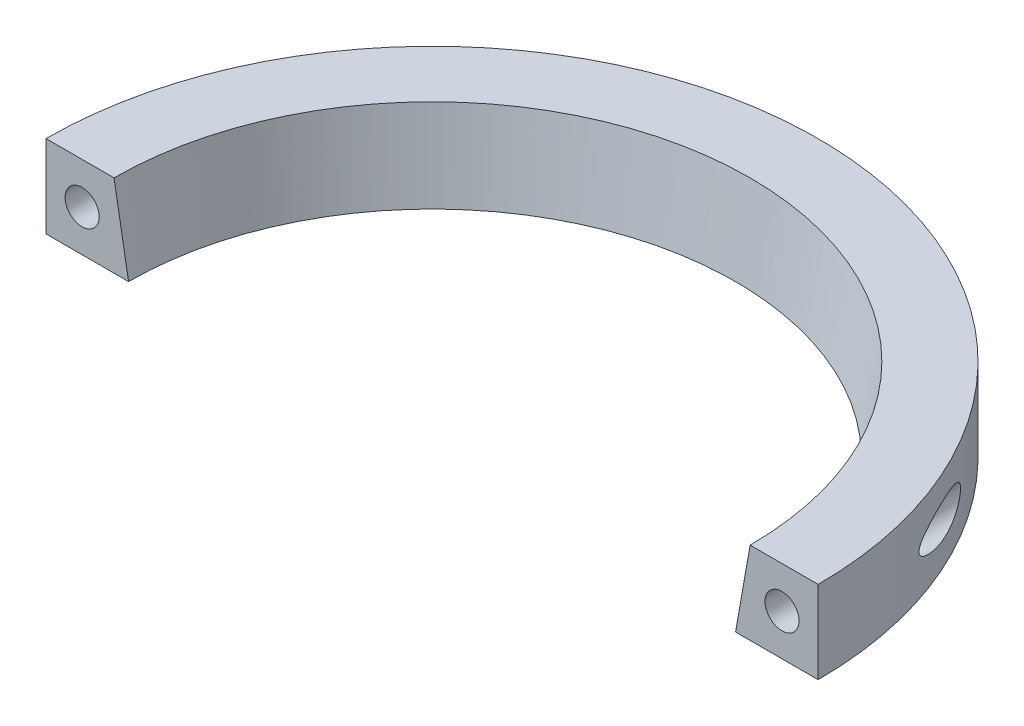
ISO-10303-21;
HEADER;
FILE_DESCRIPTION(('STEP AP214'),'2;1');
FILE_NAME('part.step','',(''),(''),'','','');
FILE_SCHEMA(('AUTOMOTIVE_DESIGN { 1 0 10303 214 1 1 1 1 }'));
ENDSEC;
DATA;
#1=APPLICATION_CONTEXT('core data for automotive mechanical design processes');
#2=APPLICATION_PROTOCOL_DEFINITION('international standard','automotive_design',2000,#1);
#3=PRODUCT_CONTEXT('',#1,'mechanical');
#4=PRODUCT('Part','Part','',(#3));
#5=PRODUCT_RELATED_PRODUCT_CATEGORY('part','',(#4));
#6=PRODUCT_DEFINITION_FORMATION('','',#4);
#7=PRODUCT_DEFINITION_CONTEXT('part definition',#1,'design');
#8=PRODUCT_DEFINITION('design','',#6,#7);
#9=PRODUCT_DEFINITION_SHAPE('','',#8);
#10=(LENGTH_UNIT() NAMED_UNIT(*) SI_UNIT(.MILLI.,.METRE.));
#11=(NAMED_UNIT(*) PLANE_ANGLE_UNIT() SI_UNIT($,.RADIAN.));
#12=(NAMED_UNIT(*) SI_UNIT($,.STERADIAN.) SOLID_ANGLE_UNIT());
#13=UNCERTAINTY_MEASURE_WITH_UNIT(LENGTH_MEASURE(1.E-05),#10,'distance_accuracy_value','');
#14=(GEOMETRIC_REPRESENTATION_CONTEXT(3) GLOBAL_UNCERTAINTY_ASSIGNED_CONTEXT((#13)) GLOBAL_UNIT_ASSIGNED_CONTEXT((#10,
#11,#12)) REPRESENTATION_CONTEXT('',''));
#15=CARTESIAN_POINT('',(0.,0.,0.));
#16=DIRECTION('',(0.,0.,1.));
#17=DIRECTION('',(1.,0.,0.));
#18=AXIS2_PLACEMENT_3D('',#15,#16,#17);
#19=CARTESIAN_POINT('',(0.,0.209999999999997,0.));
#20=DIRECTION('',(0.,1.,0.));
#21=DIRECTION('',(0.,0.,1.));
#22=AXIS2_PLACEMENT_3D('',#19,#20,#21);
#23=CONICAL_SURFACE('',#22,29.4,0.174532925199426);
#24=DIRECTION('',(0.173648177666924,0.984807753012209,0.));
#25=VECTOR('',#24,1.);
#26=CARTESIAN_POINT('',(0.,-166.525685496767,0.));
#27=LINE('',#26,#25);
#28=CARTESIAN_POINT('',(30.8106158456677,8.21,0.));
#29=VERTEX_POINT('',#28);
#30=CARTESIAN_POINT('',(29.4,0.209999999999997,0.));
#31=VERTEX_POINT('',#30);
#32=EDGE_CURVE('E64',#29,#31,#27,.F.);
#33=ORIENTED_EDGE('',*,*,#32,.F.);
#34=CARTESIAN_POINT('',(0.,8.21,0.));
#35=DIRECTION('',(0.,-1.,0.));
#36=DIRECTION('',(0.,0.,-1.));
#37=AXIS2_PLACEMENT_3D('',#34,#35,#36);
#38=CIRCLE('',#37,30.8106158456677);
#39=CARTESIAN_POINT('',(-30.8106158456677,8.21,0.));
#40=VERTEX_POINT('',#39);
#41=EDGE_CURVE('E103',#40,#29,#38,.T.);
#42=ORIENTED_EDGE('',*,*,#41,.F.);
#43=DIRECTION('',(0.173648177666924,-0.984807753012209,0.));
#44=VECTOR('',#43,1.);
#45=CARTESIAN_POINT('',(0.,-166.525685496767,0.));
#46=LINE('',#45,#44);
#47=CARTESIAN_POINT('',(-29.4,0.209999999999997,0.));
#48=VERTEX_POINT('',#47);
#49=EDGE_CURVE('E83',#48,#40,#46,.F.);
#50=ORIENTED_EDGE('',*,*,#49,.F.);
#51=CARTESIAN_POINT('',(0.,0.209999999999997,0.));
#52=DIRECTION('',(0.,-1.,0.));
#53=DIRECTION('',(0.,0.,-1.));
#54=AXIS2_PLACEMENT_3D('',#51,#52,#53);
#55=CIRCLE('',#54,29.4);
#56=EDGE_CURVE('E105',#48,#31,#55,.T.);
#57=ORIENTED_EDGE('',*,*,#56,.T.);
#58=EDGE_LOOP('',(#33,#42,#50,#57));
#59=FACE_BOUND('',#58,.T.);
#60=ADVANCED_FACE('F43',(#59),#23,.F.);
#61=CARTESIAN_POINT('',(-30.8106158456677,8.21,0.));
#62=DIRECTION('',(0.,-1.,0.));
#63=DIRECTION('',(0.,0.,-1.));
#64=AXIS2_PLACEMENT_3D('',#61,#62,#63);
#65=PLANE('',#64);
#66=DIRECTION('',(-1.,0.,0.));
#67=VECTOR('',#66,1.);
#68=CARTESIAN_POINT('',(-37.4,8.21,0.));
#69=LINE('',#68,#67);
#70=CARTESIAN_POINT('',(37.4,8.21,0.));
#71=VERTEX_POINT('',#70);
#72=EDGE_CURVE('E88',#71,#29,#69,.T.);
#73=ORIENTED_EDGE('',*,*,#72,.F.);
#74=CARTESIAN_POINT('',(0.,8.21,0.));
#75=DIRECTION('',(0.,-1.,0.));
#76=DIRECTION('',(0.,0.,-1.));
#77=AXIS2_PLACEMENT_3D('',#74,#75,#76);
#78=CIRCLE('',#77,37.4);
#79=CARTESIAN_POINT('',(-37.4,8.21,0.));
#80=VERTEX_POINT('',#79);
#81=EDGE_CURVE('E96',#80,#71,#78,.T.);
#82=ORIENTED_EDGE('',*,*,#81,.F.);
#83=EDGE_CURVE('E80',#40,#80,#69,.T.);
#84=ORIENTED_EDGE('',*,*,#83,.F.);
#85=ORIENTED_EDGE('',*,*,#41,.T.);
#86=EDGE_LOOP('',(#73,#82,#84,#85));
#87=FACE_BOUND('',#86,.T.);
#88=ADVANCED_FACE('F102',(#87),#65,.F.);
#89=CARTESIAN_POINT('',(0.,0.,0.));
#90=DIRECTION('',(0.,-1.,0.));
#91=DIRECTION('',(0.,0.,-1.));
#92=AXIS2_PLACEMENT_3D('',#89,#90,#91);
#93=CYLINDRICAL_SURFACE('',#92,37.4);
#94=CARTESIAN_POINT('',(-32.25,4.21,-18.9393109695152));
#95=CARTESIAN_POINT('',(-32.250003040921,4.25995243143123,-18.9393059814524));
#96=CARTESIAN_POINT('',(-32.2522936950472,4.30997243086646,-18.9354069065093));
#97=CARTESIAN_POINT('',(-32.2612322917816,4.40850474832843,-18.9201734607114));
#98=CARTESIAN_POINT('',(-32.2678899853057,4.45701343733852,-18.9088224508029));
#99=CARTESIAN_POINT('',(-32.2867974715193,4.56135902840237,-18.8765230999036));
#100=CARTESIAN_POINT('',(-32.2999359944275,4.61655766426438,-18.8540460884688));
#101=CARTESIAN_POINT('',(-32.3304714748397,4.7219646445357,-18.8016364887591));
#102=CARTESIAN_POINT('',(-32.3478746052607,4.77216560546622,-18.7716930919578));
#103=CARTESIAN_POINT('',(-32.3954413226306,4.89176884540605,-18.6895320870268));
#104=CARTESIAN_POINT('',(-32.4275855816299,4.95790263799236,-18.6337439135142));
#105=CARTESIAN_POINT('',(-32.4960900679473,5.07973709609658,-18.5140196841812));
#106=CARTESIAN_POINT('',(-32.5324608267851,5.13541075416725,-18.4500632337818));
#107=CARTESIAN_POINT('',(-32.6040660474101,5.23290913752684,-18.3232003989981));
#108=CARTESIAN_POINT('',(-32.6390745014654,5.27555021750971,-18.2607824375844));
#109=CARTESIAN_POINT('',(-32.7103668894221,5.35459966657334,-18.132767951375));
#110=CARTESIAN_POINT('',(-32.7466518484228,5.39100288195251,-18.0671688551935));
#111=CARTESIAN_POINT('',(-32.8199965397999,5.45842926954832,-17.933589736062));
#112=CARTESIAN_POINT('',(-32.8570571143054,5.48944621347463,-17.8656070646185));
#113=CARTESIAN_POINT('',(-32.9315771445995,5.54673570931878,-17.7278698989735));
#114=CARTESIAN_POINT('',(-32.9690367470112,5.57300644874675,-17.6581147394411));
#115=CARTESIAN_POINT('',(-33.0814648307556,5.64543217067535,-17.4471198318639));
#116=CARTESIAN_POINT('',(-33.1566521583416,5.68534881554764,-17.3038423486837));
#117=CARTESIAN_POINT('',(-33.3063975695427,5.75169675059852,-17.0138356180286));
#118=CARTESIAN_POINT('',(-33.3809549643778,5.7781147883462,-16.8671031257914));
#119=CARTESIAN_POINT('',(-33.5290081470922,5.8195941964132,-16.5708519070616));
#120=CARTESIAN_POINT('',(-33.6024989541988,5.83461295549153,-16.4213248464885));
#121=CARTESIAN_POINT('',(-33.7477375862446,5.85459380297356,-16.120734675822));
#122=CARTESIAN_POINT('',(-33.8194849072594,5.85955301720973,-15.9696711391202));
#123=CARTESIAN_POINT('',(-33.9471134997767,5.86030721858071,-15.696228588496));
#124=CARTESIAN_POINT('',(-34.0033539445983,5.85770452979636,-15.5740165303925));
#125=CARTESIAN_POINT('',(-34.1144234657601,5.84695945873502,-15.3291936697277));
#126=CARTESIAN_POINT('',(-34.1692525199266,5.83881698947968,-15.2065828609358));
#127=CARTESIAN_POINT('',(-34.2774847081481,5.817188412664,-14.9610183506749));
#128=CARTESIAN_POINT('',(-34.3308859374114,5.8036955133198,-14.8380644113834));
#129=CARTESIAN_POINT('',(-34.4361196304185,5.77144318918479,-14.5921742086833));
#130=CARTESIAN_POINT('',(-34.487952081738,5.7526837226964,-14.4692379454224));
#131=CARTESIAN_POINT('',(-34.5897530966618,5.7099252778957,-14.2241523671585));
#132=CARTESIAN_POINT('',(-34.639728848361,5.68594968002339,-14.102001967638));
#133=CARTESIAN_POINT('',(-34.7379733007361,5.63247332751245,-13.8582277258415));
#134=CARTESIAN_POINT('',(-34.7862421162901,5.60297294554034,-13.7366038486154));
#135=CARTESIAN_POINT('',(-34.8808922309029,5.53802123582026,-13.4944518028385));
#136=CARTESIAN_POINT('',(-34.9272765049264,5.50257977936406,-13.373922160716));
#137=CARTESIAN_POINT('',(-35.0180727988963,5.42490428937886,-13.134342791702));
#138=CARTESIAN_POINT('',(-35.0624856962858,5.38267331728822,-13.0152924237379));
#139=CARTESIAN_POINT('',(-35.1270607344015,5.31353422380934,-12.839525795207));
#140=CARTESIAN_POINT('',(-35.1480733422163,5.28975035968668,-12.7818876181996));
#141=CARTESIAN_POINT('',(-35.1895075280365,5.23991391107646,-12.6673700786892));
#142=CARTESIAN_POINT('',(-35.2099290456863,5.21386109599025,-12.610490793993));
#143=CARTESIAN_POINT('',(-35.2500887407307,5.15916357881616,-12.4977925710986));
#144=CARTESIAN_POINT('',(-35.2698273870624,5.1305207062452,-12.441972917622));
#145=CARTESIAN_POINT('',(-35.3085155682301,5.07015625273636,-12.3317531987848));
#146=CARTESIAN_POINT('',(-35.3274653567561,5.03843567266532,-12.2773526791772));
#147=CARTESIAN_POINT('',(-35.3678353940539,4.96500576147638,-12.1606210590382));
#148=CARTESIAN_POINT('',(-35.3890602479179,4.92253565688273,-12.0986950661808));
#149=CARTESIAN_POINT('',(-35.4296208924047,4.83071756009939,-11.9793945929706));
#150=CARTESIAN_POINT('',(-35.4489590054728,4.78137820987131,-11.9220145336844));
#151=CARTESIAN_POINT('',(-35.4773871317516,4.69526834621773,-11.8370662030225));
#152=CARTESIAN_POINT('',(-35.487458278385,4.66148724331749,-11.8068279603268));
#153=CARTESIAN_POINT('',(-35.5060651678312,4.59002222947206,-11.7507531702492));
#154=CARTESIAN_POINT('',(-35.5146031031902,4.55234401512022,-11.7249103401158));
#155=CARTESIAN_POINT('',(-35.5274866839761,4.4832614665296,-11.6858033280927));
#156=CARTESIAN_POINT('',(-35.5323440325032,4.45282691342689,-11.6710195300183));
#157=CARTESIAN_POINT('',(-35.5404738494945,4.38985869254653,-11.6462392778179));
#158=CARTESIAN_POINT('',(-35.5437486031937,4.35732812881383,-11.6362359210648));
#159=CARTESIAN_POINT('',(-35.5483803350279,4.29045926858498,-11.6220787882901));
#160=CARTESIAN_POINT('',(-35.5497157190987,4.25610496717942,-11.6179908800763));
#161=CARTESIAN_POINT('',(-35.5502017271167,4.18723703936333,-11.6165037161228));
#162=CARTESIAN_POINT('',(-35.5493530756292,4.152723469583,-11.6191022421235));
#163=CARTESIAN_POINT('',(-35.5458857126761,4.09000480298218,-11.6297046916516));
#164=CARTESIAN_POINT('',(-35.5435509069154,4.06162859981835,-11.6368414708256));
#165=CARTESIAN_POINT('',(-35.5376129255177,4.00628631733695,-11.6549628437515));
#166=CARTESIAN_POINT('',(-35.5340090522698,3.97932102298394,-11.6659495538077));
#167=CARTESIAN_POINT('',(-35.5230780480731,3.90993811826344,-11.6992048761214));
#168=CARTESIAN_POINT('',(-35.51485772545,3.86895586888882,-11.7241514615594));
#169=CARTESIAN_POINT('',(-35.4965153825347,3.79138445503394,-11.779569293759));
#170=CARTESIAN_POINT('',(-35.4863870514696,3.75481054907108,-11.8100588619942));
#171=CARTESIAN_POINT('',(-35.4650022902094,3.68603386392152,-11.874120471547));
#172=CARTESIAN_POINT('',(-35.4537663761862,3.65377078837285,-11.9076357407975));
#173=CARTESIAN_POINT('',(-35.4303669130415,3.59229485827762,-11.9770800383619));
#174=CARTESIAN_POINT('',(-35.4182024190267,3.56308518433614,-12.0130115207892));
#175=CARTESIAN_POINT('',(-35.3931412278254,3.50717060230387,-12.0866484547947));
#176=CARTESIAN_POINT('',(-35.380242945814,3.48047147372592,-12.1243577134025));
#177=CARTESIAN_POINT('',(-35.3538834140515,3.42926281778478,-12.2010069931674));
#178=CARTESIAN_POINT('',(-35.3404224062066,3.40475236347412,-12.239946483746));
#179=CARTESIAN_POINT('',(-35.3051206909485,3.3439798661863,-12.3415061654108));
#180=CARTESIAN_POINT('',(-35.2829259982093,3.30909633784956,-12.4048273974074));
#181=CARTESIAN_POINT('',(-35.237579020906,3.24305665459419,-12.5330628876053));
#182=CARTESIAN_POINT('',(-35.2144262676214,3.21190235387965,-12.5979779190862));
#183=CARTESIAN_POINT('',(-35.1436735094947,3.12300827349466,-12.7945922542695));
#184=CARTESIAN_POINT('',(-35.0948459049371,3.06994658622343,-12.927967860478));
#185=CARTESIAN_POINT('',(-34.9942917406438,2.97311238688459,-13.1977433298338));
#186=CARTESIAN_POINT('',(-34.9425516142321,2.92938884281856,-13.3341551835886));
#187=CARTESIAN_POINT('',(-34.8367180777574,2.8500635827698,-13.608256016594));
#188=CARTESIAN_POINT('',(-34.7826268366438,2.81445456269351,-13.7459437302823));
#189=CARTESIAN_POINT('',(-34.678220390221,2.75394309485988,-14.0070914313479));
#190=CARTESIAN_POINT('',(-34.628133088895,2.72829787295041,-14.1304726043962));
#191=CARTESIAN_POINT('',(-34.5262714995888,2.68245168688733,-14.3775670688666));
#192=CARTESIAN_POINT('',(-34.4744970043915,2.66225139431276,-14.5012803993582));
#193=CARTESIAN_POINT('',(-34.3692833195303,2.62716996310273,-14.7489146553145));
#194=CARTESIAN_POINT('',(-34.3158423684699,2.61229467535692,-14.8728356597344));
#195=CARTESIAN_POINT('',(-34.2074139141674,2.58793819800907,-15.1205527521184));
#196=CARTESIAN_POINT('',(-34.1524262042419,2.57845773291054,-15.2443488210767));
#197=CARTESIAN_POINT('',(-34.0411763750572,2.56509952471183,-15.49117732477));
#198=CARTESIAN_POINT('',(-33.9849191022733,2.56120325352032,-15.6142109299043));
#199=CARTESIAN_POINT('',(-33.8710614292756,2.55927160184776,-15.8596815224611));
#200=CARTESIAN_POINT('',(-33.8134612656704,2.56123519652515,-15.9821186104581));
#201=CARTESIAN_POINT('',(-33.6971085775815,2.57148170213351,-16.2260008545448));
#202=CARTESIAN_POINT('',(-33.6383575680828,2.5797567863431,-16.3474470510371));
#203=CARTESIAN_POINT('',(-33.5198254235491,2.60325836242518,-16.5891353045464));
#204=CARTESIAN_POINT('',(-33.4600445645043,2.61848301892694,-16.70937767093));
#205=CARTESIAN_POINT('',(-33.3441736631368,2.65533823346184,-16.9393448325563));
#206=CARTESIAN_POINT('',(-33.2881398702023,2.67640802248214,-17.0491866387508));
#207=CARTESIAN_POINT('',(-33.1756798838446,2.72620530137288,-17.2669999748657));
#208=CARTESIAN_POINT('',(-33.1192535468462,2.75493575398866,-17.3749707639316));
#209=CARTESIAN_POINT('',(-33.0065958163215,2.82126051749046,-17.5880389192485));
#210=CARTESIAN_POINT('',(-32.950364255503,2.85883818935977,-17.6931412710869));
#211=CARTESIAN_POINT('',(-32.8388141729378,2.94456161253383,-17.899329867107));
#212=CARTESIAN_POINT('',(-32.7834946663703,2.99269503577367,-18.0004206351069));
#213=CARTESIAN_POINT('',(-32.6746380463612,3.10229787563907,-18.1972707455172));
#214=CARTESIAN_POINT('',(-32.6211112809239,3.16383306069725,-18.2930007594948));
#215=CARTESIAN_POINT('',(-32.5444002604095,3.26835682203029,-18.4289104742725));
#216=CARTESIAN_POINT('',(-32.5194670846295,3.30515966035961,-18.4728623821739));
#217=CARTESIAN_POINT('',(-32.4712719294046,3.38335175816054,-18.5574473983211));
#218=CARTESIAN_POINT('',(-32.4480082866089,3.42473634528271,-18.5980838154666));
#219=CARTESIAN_POINT('',(-32.4045098211826,3.51123100888868,-18.673767451087));
#220=CARTESIAN_POINT('',(-32.3842033975921,3.55618557101272,-18.7089490067652));
#221=CARTESIAN_POINT('',(-32.3466568456291,3.65122168525294,-18.7737901169529));
#222=CARTESIAN_POINT('',(-32.329418790126,3.70130666756293,-18.8034459391212));
#223=CARTESIAN_POINT('',(-32.298973708579,3.80715268918387,-18.8556948276426));
#224=CARTESIAN_POINT('',(-32.2858234164153,3.86298043011605,-18.8781885876971));
#225=CARTESIAN_POINT('',(-32.2652674728955,3.9785821229174,-18.9133007301564));
#226=CARTESIAN_POINT('',(-32.2578382040157,4.03833873358731,-18.9259597144188));
#227=CARTESIAN_POINT('',(-32.2525018205757,4.11728607153887,-18.9350502744358));
#228=CARTESIAN_POINT('',(-32.2515659124604,4.13577562825845,-18.9366443047199));
#229=CARTESIAN_POINT('',(-32.250314381556,4.17284032941674,-18.9387756737397));
#230=CARTESIAN_POINT('',(-32.249998868643,4.1914154884324,-18.939312825295));
#231=CARTESIAN_POINT('',(-32.25,4.21,-18.9393109695152));
#232=B_SPLINE_CURVE_WITH_KNOTS('',3,(#94,#95,#96,#97,#98,#99,#100,#101,#102,#103,#104,#105,#106,
#107,#108,#109,#110,#111,#112,#113,#114,#115,#116,#117,#118,#119,#120,#121,#122,#123,#124,#125,
#126,#127,#128,#129,#130,#131,#132,#133,#134,#135,#136,#137,#138,#139,#140,#141,#142,#143,#144,
#145,#146,#147,#148,#149,#150,#151,#152,#153,#154,#155,#156,#157,#158,#159,#160,#161,#162,#163,
#164,#165,#166,#167,#168,#169,#170,#171,#172,#173,#174,#175,#176,#177,#178,#179,#180,#181,#182,
#183,#184,#185,#186,#187,#188,#189,#190,#191,#192,#193,#194,#195,#196,#197,#198,#199,#200,#201,
#202,#203,#204,#205,#206,#207,#208,#209,#210,#211,#212,#213,#214,#215,#216,#217,#218,#219,#220,
#221,#222,#223,#224,#225,#226,#227,#228,#229,#230,#231),.UNSPECIFIED.,.T.,.F.,(4,2,2,2,2,2,2,2,
2,2,2,2,2,2,2,2,2,2,2,2,2,2,2,2,2,2,2,2,2,2,2,2,2,2,2,2,2,2,2,2,2,2,2,2,2,2,2,2,2,2,2,2,2,2,2,2,
2,2,2,2,2,2,2,2,2,2,2,2,4),(0.,0.149779530737637,0.299894639403961,0.481966078215499,
0.66430263413866,0.939652984735575,1.21570478686932,1.4652603692312,1.71502114968492,
1.96506883950253,2.21521181710692,2.71435875621433,3.21399480218453,3.71548944471933,
4.21712735185833,4.62067698984021,5.02423296397418,5.42830285647754,5.83237594825931,
6.23467385454052,6.63694463415133,7.03855353484757,7.4399818526693,7.6373395446979,
7.83471731809659,8.03195674456314,8.22913224262428,8.46295280840299,8.69648182690896,
8.83554333471149,8.97440436793215,9.07660542918438,9.17865846990673,9.28183933972092,
9.38498598315383,9.47269619248133,9.56045469187576,9.70564127483096,9.85131677556365,
9.99467414220873,10.1381793808029,10.2820072838474,10.4257739810808,10.6524848467624,
10.8793079708982,11.3336461895165,11.7903113796582,12.2465638754836,12.6532655454996,
13.0600173552778,13.4672147247866,13.8744667664073,14.2803644117224,14.6861910730922,
15.0915152954917,15.4967325343009,15.8718064713704,16.2470256784191,16.6215447674577,
16.9956287631123,17.3715916711888,17.5589166902695,17.746052409737,17.9273793805291,
18.1088283876214,18.2926935741934,18.4757955980454,18.5315103346963,18.5872349379204),.UNSPECIFIED.);
#233=CARTESIAN_POINT('',(-32.25,4.21,-18.9393109695152));
#234=VERTEX_POINT('',#233);
#235=EDGE_CURVE('E133',#234,#234,#232,.T.);
#236=ORIENTED_EDGE('',*,*,#235,.T.);
#237=EDGE_LOOP('',(#236));
#238=FACE_BOUND('',#237,.T.);
#239=CARTESIAN_POINT('',(35.55,4.21,-11.6171209858554));
#240=CARTESIAN_POINT('',(35.5499994682783,4.24368247687896,-11.6171226552124));
#241=CARTESIAN_POINT('',(35.5489551704888,4.27736982730972,-11.620319745938));
#242=CARTESIAN_POINT('',(35.5449241501142,4.34352577418337,-11.6326440062445));
#243=CARTESIAN_POINT('',(35.5419343202271,4.37599233294645,-11.6417806621654));
#244=CARTESIAN_POINT('',(35.5333842765634,4.44694025073435,-11.6678545533662));
#245=CARTESIAN_POINT('',(35.5273627679664,4.4848416139824,-11.6861876082126));
#246=CARTESIAN_POINT('',(35.5134959802766,4.55711867465923,-11.7282606736269));
#247=CARTESIAN_POINT('',(35.5056465758033,4.59148613966079,-11.7520129122643));
#248=CARTESIAN_POINT('',(35.481959655402,4.6828555704277,-11.8234019176079));
#249=CARTESIAN_POINT('',(35.4647116663888,4.73628057733664,-11.8750796040871));
#250=CARTESIAN_POINT('',(35.4278413812113,4.83529035027536,-11.9846337780311));
#251=CARTESIAN_POINT('',(35.4082119392264,4.88085047388509,-12.04252885869));
#252=CARTESIAN_POINT('',(35.3724970858217,4.95531378773588,-12.1469621787855));
#253=CARTESIAN_POINT('',(35.3567599519192,4.985526396826,-12.1927002970275));
#254=CARTESIAN_POINT('',(35.3245681074942,5.04318383720766,-12.2856547082094));
#255=CARTESIAN_POINT('',(35.308113136666,5.07062765231231,-12.3328715355853));
#256=CARTESIAN_POINT('',(35.2578054802596,5.14956393280626,-12.4762735695969));
#257=CARTESIAN_POINT('',(35.2230592200084,5.19756353536464,-12.5740662265082));
#258=CARTESIAN_POINT('',(35.1515484328459,5.28675120124603,-12.7726218882067));
#259=CARTESIAN_POINT('',(35.1147738844519,5.32790047426099,-12.8733982393422));
#260=CARTESIAN_POINT('',(35.0396698931256,5.40436994784153,-13.0764383356441));
#261=CARTESIAN_POINT('',(35.0013418818957,5.43969537015134,-13.1787006579432));
#262=CARTESIAN_POINT('',(34.9193706883913,5.50866452199856,-13.3944827032715));
#263=CARTESIAN_POINT('',(34.8755781765204,5.5417909175442,-13.5081098279629));
#264=CARTESIAN_POINT('',(34.7863862301174,5.60274363927432,-13.736168745922));
#265=CARTESIAN_POINT('',(34.7409864803064,5.63056891867338,-13.8506006934979));
#266=CARTESIAN_POINT('',(34.6486228879719,5.681340841206,-14.0800654591813));
#267=CARTESIAN_POINT('',(34.6016573741979,5.70428206499812,-14.1950988011368));
#268=CARTESIAN_POINT('',(34.506275906189,5.74545563547477,-14.4254105883917));
#269=CARTESIAN_POINT('',(34.4578597991538,5.76368748413095,-14.5406890583153));
#270=CARTESIAN_POINT('',(34.3109564926872,5.81131486650414,-14.8855793098651));
#271=CARTESIAN_POINT('',(34.2103922335396,5.83387126034672,-15.1152954088129));
#272=CARTESIAN_POINT('',(34.0043358747897,5.85996450519346,-15.5733159821687));
#273=CARTESIAN_POINT('',(33.8988488221135,5.8635204216976,-15.8016216419203));
#274=CARTESIAN_POINT('',(33.6933362793738,5.84994397272499,-16.2348740180461));
#275=CARTESIAN_POINT('',(33.5936930159261,5.83467306946266,-16.4400482477438));
#276=CARTESIAN_POINT('',(33.4421181700837,5.79605058888099,-16.7450800886247));
#277=CARTESIAN_POINT('',(33.3911702180065,5.78052493733502,-16.8464396129842));
#278=CARTESIAN_POINT('',(33.2887949892258,5.74358879475525,-17.0478407299593));
#279=CARTESIAN_POINT('',(33.2373677737507,5.72217904575139,-17.1478824870896));
#280=CARTESIAN_POINT('',(33.1336519248446,5.67238240767356,-17.347446850233));
#281=CARTESIAN_POINT('',(33.0813605473666,5.64391182979678,-17.4469474197191));
#282=CARTESIAN_POINT('',(32.9769257026534,5.57902113781097,-17.6435472719169));
#283=CARTESIAN_POINT('',(32.9247823724159,5.5425951949566,-17.7406447355382));
#284=CARTESIAN_POINT('',(32.8214827295274,5.46045977199558,-17.9310334598993));
#285=CARTESIAN_POINT('',(32.7703240303134,5.41477700590877,-18.0243347659563));
#286=CARTESIAN_POINT('',(32.6699941093832,5.31214768312252,-18.2055529228832));
#287=CARTESIAN_POINT('',(32.6208192124039,5.25522322749259,-18.2934799024126));
#288=CARTESIAN_POINT('',(32.5299738353796,5.13244999476658,-18.454502648338));
#289=CARTESIAN_POINT('',(32.4880172302091,5.06764758476045,-18.528220543892));
#290=CARTESIAN_POINT('',(32.4102115125455,4.92388805248498,-18.6639816910188));
#291=CARTESIAN_POINT('',(32.3743243048473,4.8450261300483,-18.7260980391384));
#292=CARTESIAN_POINT('',(32.3284624721856,4.71487164549116,-18.8050919851654));
#293=CARTESIAN_POINT('',(32.3144715494209,4.66934521545711,-18.8291136780862));
#294=CARTESIAN_POINT('',(32.2900409496405,4.57458417111339,-18.8709786926619));
#295=CARTESIAN_POINT('',(32.2796000810526,4.52535080782274,-18.8888240874212));
#296=CARTESIAN_POINT('',(32.2630584613481,4.42354117696999,-18.9170647191701));
#297=CARTESIAN_POINT('',(32.2569978903625,4.37093866305809,-18.927390990097));
#298=CARTESIAN_POINT('',(32.2500370282672,4.2644237947419,-18.9392492919137));
#299=CARTESIAN_POINT('',(32.2491322097116,4.21051263130709,-18.9407890385585));
#300=CARTESIAN_POINT('',(32.2524037255057,4.10868326759371,-18.93521739458));
#301=CARTESIAN_POINT('',(32.2560866327741,4.06069944283642,-18.928946117369));
#302=CARTESIAN_POINT('',(32.2673651902734,3.96657667256433,-18.9097135424219));
#303=CARTESIAN_POINT('',(32.2749632688803,3.92043889121575,-18.8967480926306));
#304=CARTESIAN_POINT('',(32.2963525300489,3.81706720264777,-18.8601745119834));
#305=CARTESIAN_POINT('',(32.311331975004,3.76081063511761,-18.834515631902));
#306=CARTESIAN_POINT('',(32.3455479292245,3.65380579375016,-18.7756941663957));
#307=CARTESIAN_POINT('',(32.3647929647975,3.6030688600336,-18.7425165490631));
#308=CARTESIAN_POINT('',(32.4177551639686,3.48058294973156,-18.650824448263));
#309=CARTESIAN_POINT('',(32.4535980299447,3.41268924772449,-18.5884314889572));
#310=CARTESIAN_POINT('',(32.5294486630221,3.28836510713235,-18.4553755878205));
#311=CARTESIAN_POINT('',(32.5694670516865,3.23196503630817,-18.3846914956764));
#312=CARTESIAN_POINT('',(32.6486322714173,3.13284212845018,-18.243706802609));
#313=CARTESIAN_POINT('',(32.6876030666132,3.08939511069503,-18.1738074121775));
#314=CARTESIAN_POINT('',(32.7667324269242,3.00942888753027,-18.0307498302588));
#315=CARTESIAN_POINT('',(32.8068919767444,2.97291562248739,-17.9575889101739));
#316=CARTESIAN_POINT('',(32.887859076824,2.90583923527479,-17.8088714125537));
#317=CARTESIAN_POINT('',(32.9286671490074,2.87528119854696,-17.7333128510245));
#318=CARTESIAN_POINT('',(33.0105501481321,2.81937703755867,-17.5804185045217));
#319=CARTESIAN_POINT('',(33.0516251685769,2.79403285371705,-17.5030820697455));
#320=CARTESIAN_POINT('',(33.174707167338,2.72496660690864,-17.2693287251131));
#321=CARTESIAN_POINT('',(33.2567270147007,2.68808851640717,-17.1108818312346));
#322=CARTESIAN_POINT('',(33.4195741968804,2.62912225407114,-16.7906057014211));
#323=CARTESIAN_POINT('',(33.5004002608002,2.60704886919682,-16.6287732498079));
#324=CARTESIAN_POINT('',(33.6605893485136,2.57541103324399,-16.302085768243));
#325=CARTESIAN_POINT('',(33.7399417940737,2.56591651753997,-16.137218964115));
#326=CARTESIAN_POINT('',(33.8962663272875,2.55815080359369,-15.8062209095848));
#327=CARTESIAN_POINT('',(33.9732395482316,2.55987417653198,-15.6400903096634));
#328=CARTESIAN_POINT('',(34.1028085771889,2.57161872933783,-15.3549807306801));
#329=CARTESIAN_POINT('',(34.1560490872771,2.57911114795368,-15.2361810091979));
#330=CARTESIAN_POINT('',(34.2611334494357,2.59911684950966,-14.998387513245));
#331=CARTESIAN_POINT('',(34.3129773334853,2.61163001738262,-14.879393743284));
#332=CARTESIAN_POINT('',(34.4152806225252,2.64161499069909,-14.6412186889607));
#333=CARTESIAN_POINT('',(34.4657377897006,2.65909434782855,-14.5220373960482));
#334=CARTESIAN_POINT('',(34.5651158571545,2.69904358795664,-14.2838863833964));
#335=CARTESIAN_POINT('',(34.6140369498947,2.72151284287792,-14.1649166389276));
#336=CARTESIAN_POINT('',(34.7098291411224,2.77140116986386,-13.9285272872565));
#337=CARTESIAN_POINT('',(34.7567151130799,2.79877207799532,-13.8111035767322));
#338=CARTESIAN_POINT('',(34.8488208760305,2.85897525526437,-13.5770208510534));
#339=CARTESIAN_POINT('',(34.8940409801031,2.89180649173831,-13.4603616956332));
#340=CARTESIAN_POINT('',(34.9826035630863,2.96352053725615,-13.2284851780051));
#341=CARTESIAN_POINT('',(35.0259497150387,3.00239075160211,-13.1132653424461));
#342=CARTESIAN_POINT('',(35.1106434039406,3.08730184848147,-12.8847789244606));
#343=CARTESIAN_POINT('',(35.1519922204684,3.13333805814819,-12.7715111222215));
#344=CARTESIAN_POINT('',(35.205365898881,3.20056116612134,-12.623143150926));
#345=CARTESIAN_POINT('',(35.2184536874431,3.21769948313764,-12.5865804725061));
#346=CARTESIAN_POINT('',(35.2443481589263,3.25307340575066,-12.5138887653537));
#347=CARTESIAN_POINT('',(35.2571548292742,3.27130906029043,-12.4777597560499));
#348=CARTESIAN_POINT('',(35.2952688091127,3.32805857895559,-12.3697146386808));
#349=CARTESIAN_POINT('',(35.3201135577482,3.36842135988593,-12.2985758747193));
#350=CARTESIAN_POINT('',(35.3598231935909,3.44028464866252,-12.1838093379247));
#351=CARTESIAN_POINT('',(35.3751540286171,3.46998574891118,-12.1392176497215));
#352=CARTESIAN_POINT('',(35.4049700277388,3.53267144832758,-12.0519798931625));
#353=CARTESIAN_POINT('',(35.4194541099465,3.56566010852727,-12.0093363284715));
#354=CARTESIAN_POINT('',(35.4471387893264,3.63532059080594,-11.9273721129302));
#355=CARTESIAN_POINT('',(35.4603496137679,3.67195722128132,-11.8880253871016));
#356=CARTESIAN_POINT('',(35.4851148916363,3.75001820235458,-11.8138957627847));
#357=CARTESIAN_POINT('',(35.496674612097,3.79142653109101,-11.7790983833587));
#358=CARTESIAN_POINT('',(35.5137027843172,3.86454941926169,-11.727633115703));
#359=CARTESIAN_POINT('',(35.5198894798409,3.89460718834264,-11.7088752179267));
#360=CARTESIAN_POINT('',(35.5308372581938,3.95725929487748,-11.6756117349185));
#361=CARTESIAN_POINT('',(35.5355999160583,3.98985077928605,-11.6611014520514));
#362=CARTESIAN_POINT('',(35.5428241693593,4.0533851019897,-11.6390622998712));
#363=CARTESIAN_POINT('',(35.5454869816598,4.08408853843955,-11.6309237334195));
#364=CARTESIAN_POINT('',(35.5490742393972,4.14652728312988,-11.6199550629722));
#365=CARTESIAN_POINT('',(35.5500005010338,4.17826147794513,-11.6171194128438));
#366=CARTESIAN_POINT('',(35.55,4.21,-11.6171209858554));
#367=B_SPLINE_CURVE_WITH_KNOTS('',3,(#239,#240,#241,#242,#243,#244,#245,#246,#247,#248,#249,
#250,#251,#252,#253,#254,#255,#256,#257,#258,#259,#260,#261,#262,#263,#264,#265,#266,#267,#268,
#269,#270,#271,#272,#273,#274,#275,#276,#277,#278,#279,#280,#281,#282,#283,#284,#285,#286,#287,
#288,#289,#290,#291,#292,#293,#294,#295,#296,#297,#298,#299,#300,#301,#302,#303,#304,#305,#306,
#307,#308,#309,#310,#311,#312,#313,#314,#315,#316,#317,#318,#319,#320,#321,#322,#323,#324,#325,
#326,#327,#328,#329,#330,#331,#332,#333,#334,#335,#336,#337,#338,#339,#340,#341,#342,#343,#344,
#345,#346,#347,#348,#349,#350,#351,#352,#353,#354,#355,#356,#357,#358,#359,#360,#361,#362,#363,
#364,#365,#366),.UNSPECIFIED.,.T.,.F.,(4,2,2,2,2,2,2,2,2,2,2,2,2,2,2,2,2,2,2,2,2,2,2,2,2,2,2,2,
2,2,2,2,2,2,2,2,2,2,2,2,2,2,2,2,2,2,2,2,2,2,2,2,2,2,2,2,2,2,2,2,2,2,2,4),(0.,0.100902604953385,
0.201966763133163,0.328827490689112,0.45597735377775,0.683613659892378,0.91195074217552,
1.08293345509778,1.25397869456084,1.59660952637787,1.94111898495218,2.28531785163567,
2.66377537163381,3.04230754649939,3.4212575759141,3.80024766386216,4.55477442480359,
5.30854393450025,5.99340915982462,6.33678515228684,6.68011786224974,7.02773262923323,
7.37560294655692,7.722483297053,8.06868835352823,8.38781282574322,8.7048532805253,
8.86439640079557,9.02388591759191,9.18482046725025,9.34561367286395,9.49051258849399,
9.63550148571905,9.82529828712275,10.0154779425752,10.3106051134677,10.6065022202593,
10.8792893254192,11.1523090918913,11.4255609905395,11.6989144010145,12.2445831737976,
12.7907961528831,13.3400333707889,13.8890048089183,14.2801059305536,14.6711980893177,
15.0628881630449,15.4545289627425,15.8425138415779,16.2304254275251,16.6175385967906,
17.0044003832125,17.1317294559585,17.2590642120059,17.5152364315135,17.6823222354683,
17.8496170563216,18.0154308527756,18.1807032869581,18.2883271445261,18.3958315222381,
18.4910102210403,18.5860893200096),.UNSPECIFIED.);
#368=CARTESIAN_POINT('',(35.55,4.21,-11.6171209858554));
#369=VERTEX_POINT('',#368);
#370=EDGE_CURVE('E89',#369,#369,#367,.T.);
#371=ORIENTED_EDGE('',*,*,#370,.T.);
#372=EDGE_LOOP('',(#371));
#373=FACE_BOUND('',#372,.T.);
#374=DIRECTION('',(0.,-1.,0.));
#375=VECTOR('',#374,1.);
#376=CARTESIAN_POINT('',(-37.4,0.209999999999997,0.));
#377=LINE('',#376,#375);
#378=CARTESIAN_POINT('',(-37.4,0.209999999999997,0.));
#379=VERTEX_POINT('',#378);
#380=EDGE_CURVE('E56',#80,#379,#377,.T.);
#381=ORIENTED_EDGE('',*,*,#380,.F.);
#382=ORIENTED_EDGE('',*,*,#81,.T.);
#383=DIRECTION('',(0.,-1.,0.));
#384=VECTOR('',#383,1.);
#385=CARTESIAN_POINT('',(37.4,0.,0.));
#386=LINE('',#385,#384);
#387=CARTESIAN_POINT('',(37.4,0.209999999999997,0.));
#388=VERTEX_POINT('',#387);
#389=EDGE_CURVE('E99',#388,#71,#386,.F.);
#390=ORIENTED_EDGE('',*,*,#389,.F.);
#391=CARTESIAN_POINT('',(0.,0.209999999999997,0.));
#392=DIRECTION('',(0.,-1.,0.));
#393=DIRECTION('',(0.,0.,-1.));
#394=AXIS2_PLACEMENT_3D('',#391,#392,#393);
#395=CIRCLE('',#394,37.4);
#396=EDGE_CURVE('E98',#379,#388,#395,.T.);
#397=ORIENTED_EDGE('',*,*,#396,.F.);
#398=EDGE_LOOP('',(#381,#382,#390,#397));
#399=FACE_BOUND('',#398,.T.);
#400=ADVANCED_FACE('F94',(#238,#373,#399),#93,.T.);
#401=CARTESIAN_POINT('',(-37.4,0.209999999999997,0.));
#402=DIRECTION('',(0.,1.,0.));
#403=DIRECTION('',(0.,0.,1.));
#404=AXIS2_PLACEMENT_3D('',#401,#402,#403);
#405=PLANE('',#404);
#406=DIRECTION('',(1.,0.,0.));
#407=VECTOR('',#406,1.);
#408=CARTESIAN_POINT('',(-37.4,0.209999999999997,0.));
#409=LINE('',#408,#407);
#410=EDGE_CURVE('E11',#379,#48,#409,.T.);
#411=ORIENTED_EDGE('',*,*,#410,.F.);
#412=ORIENTED_EDGE('',*,*,#396,.T.);
#413=EDGE_CURVE('E46',#31,#388,#409,.T.);
#414=ORIENTED_EDGE('',*,*,#413,.F.);
#415=ORIENTED_EDGE('',*,*,#56,.F.);
#416=EDGE_LOOP('',(#411,#412,#414,#415));
#417=FACE_BOUND('',#416,.T.);
#418=ADVANCED_FACE('F149',(#417),#405,.F.);
#419=CARTESIAN_POINT('',(-37.4,0.209999999999997,0.));
#420=DIRECTION('',(0.,0.,1.));
#421=DIRECTION('',(1.,0.,0.));
#422=AXIS2_PLACEMENT_3D('',#419,#420,#421);
#423=PLANE('',#422);
#424=CARTESIAN_POINT('',(33.9,4.21,0.));
#425=DIRECTION('',(0.,0.,1.));
#426=DIRECTION('',(1.,0.,0.));
#427=AXIS2_PLACEMENT_3D('',#424,#425,#426);
#428=CIRCLE('',#427,1.64999999999999);
#429=CARTESIAN_POINT('',(35.55,4.21,0.));
#430=VERTEX_POINT('',#429);
#431=EDGE_CURVE('E120',#430,#430,#428,.T.);
#432=ORIENTED_EDGE('',*,*,#431,.F.);
#433=EDGE_LOOP('',(#432));
#434=FACE_BOUND('',#433,.T.);
#435=ORIENTED_EDGE('',*,*,#32,.T.);
#436=ORIENTED_EDGE('',*,*,#413,.T.);
#437=ORIENTED_EDGE('',*,*,#389,.T.);
#438=ORIENTED_EDGE('',*,*,#72,.T.);
#439=EDGE_LOOP('',(#435,#436,#437,#438));
#440=FACE_BOUND('',#439,.T.);
#441=ADVANCED_FACE('F145',(#434,#440),#423,.T.);
#442=CARTESIAN_POINT('',(-33.9,4.21,0.));
#443=DIRECTION('',(0.,0.,1.));
#444=DIRECTION('',(1.,0.,0.));
#445=AXIS2_PLACEMENT_3D('',#442,#443,#444);
#446=CIRCLE('',#445,1.64999999999999);
#447=CARTESIAN_POINT('',(-32.25,4.21,0.));
#448=VERTEX_POINT('',#447);
#449=EDGE_CURVE('E139',#448,#448,#446,.T.);
#450=ORIENTED_EDGE('',*,*,#449,.F.);
#451=EDGE_LOOP('',(#450));
#452=FACE_BOUND('',#451,.T.);
#453=ORIENTED_EDGE('',*,*,#49,.T.);
#454=ORIENTED_EDGE('',*,*,#83,.T.);
#455=ORIENTED_EDGE('',*,*,#380,.T.);
#456=ORIENTED_EDGE('',*,*,#410,.T.);
#457=EDGE_LOOP('',(#453,#454,#455,#456));
#458=FACE_BOUND('',#457,.T.);
#459=ADVANCED_FACE('F81',(#452,#458),#423,.T.);
#460=CARTESIAN_POINT('',(33.9,4.21,0.));
#461=DIRECTION('',(0.,0.,1.));
#462=DIRECTION('',(1.,0.,0.));
#463=AXIS2_PLACEMENT_3D('',#460,#461,#462);
#464=CYLINDRICAL_SURFACE('',#463,1.64999999999999);
#465=ORIENTED_EDGE('',*,*,#370,.F.);
#466=EDGE_LOOP('',(#465));
#467=FACE_BOUND('',#466,.T.);
#468=ORIENTED_EDGE('',*,*,#431,.T.);
#469=EDGE_LOOP('',(#468));
#470=FACE_BOUND('',#469,.T.);
#471=ADVANCED_FACE('F124',(#467,#470),#464,.F.);
#472=CARTESIAN_POINT('',(-33.9,4.21,0.));
#473=DIRECTION('',(0.,0.,1.));
#474=DIRECTION('',(1.,0.,0.));
#475=AXIS2_PLACEMENT_3D('',#472,#473,#474);
#476=CYLINDRICAL_SURFACE('',#475,1.64999999999999);
#477=ORIENTED_EDGE('',*,*,#235,.F.);
#478=EDGE_LOOP('',(#477));
#479=FACE_BOUND('',#478,.T.);
#480=ORIENTED_EDGE('',*,*,#449,.T.);
#481=EDGE_LOOP('',(#480));
#482=FACE_BOUND('',#481,.T.);
#483=ADVANCED_FACE('F128',(#479,#482),#476,.F.);
#484=CLOSED_SHELL('',(#60,#88,#400,#418,#441,#459,#471,#483));
#485=MANIFOLD_SOLID_BREP('B2',#484);
#486=ADVANCED_BREP_SHAPE_REPRESENTATION('',(#18,#485),#14);
#487=SHAPE_DEFINITION_REPRESENTATION(#9,#486);
ENDSEC;
END-ISO-10303-21;
